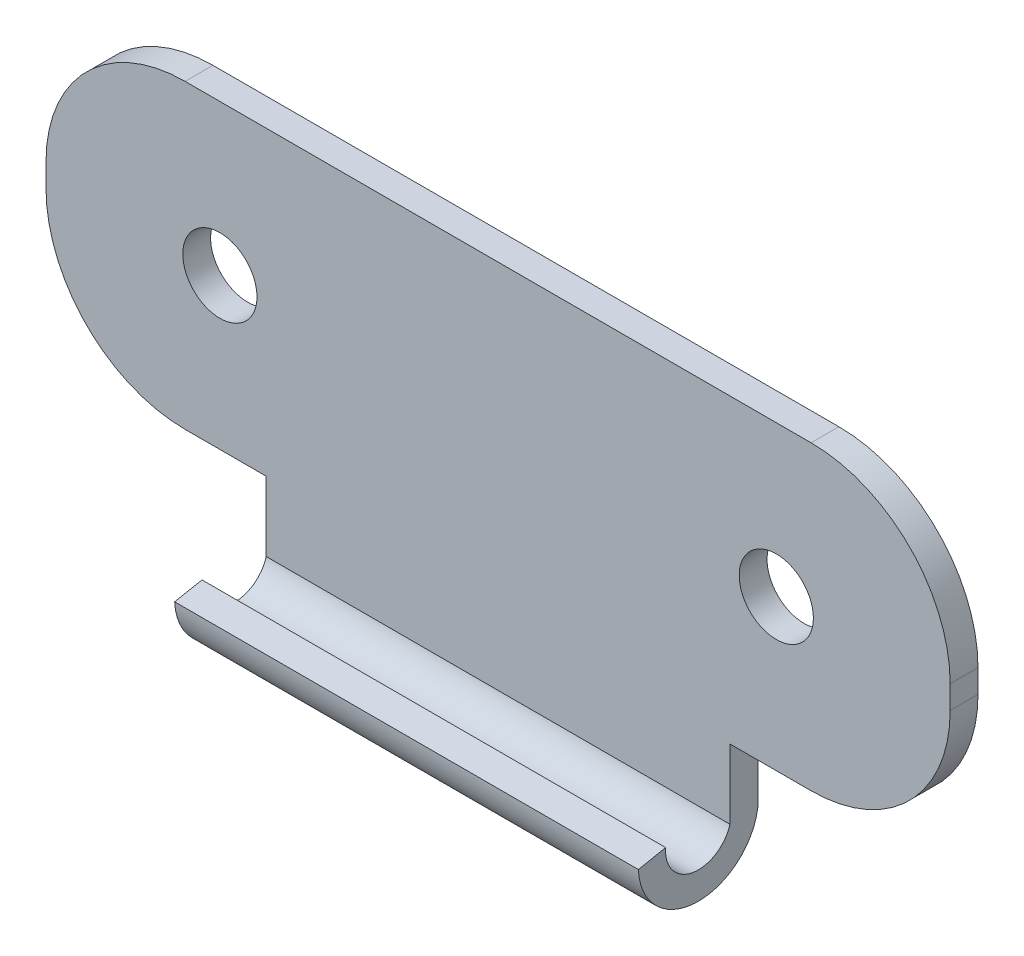
ISO-10303-21;
HEADER;
FILE_DESCRIPTION(('STEP AP214'),'2;1');
FILE_NAME('part.step','',(''),(''),'','','');
FILE_SCHEMA(('AUTOMOTIVE_DESIGN { 1 0 10303 214 1 1 1 1 }'));
ENDSEC;
DATA;
#1=APPLICATION_CONTEXT('core data for automotive mechanical design processes');
#2=APPLICATION_PROTOCOL_DEFINITION('international standard','automotive_design',2000,#1);
#3=PRODUCT_CONTEXT('',#1,'mechanical');
#4=PRODUCT('Part','Part','',(#3));
#5=PRODUCT_RELATED_PRODUCT_CATEGORY('part','',(#4));
#6=PRODUCT_DEFINITION_FORMATION('','',#4);
#7=PRODUCT_DEFINITION_CONTEXT('part definition',#1,'design');
#8=PRODUCT_DEFINITION('design','',#6,#7);
#9=PRODUCT_DEFINITION_SHAPE('','',#8);
#10=(LENGTH_UNIT() NAMED_UNIT(*) SI_UNIT(.MILLI.,.METRE.));
#11=(NAMED_UNIT(*) PLANE_ANGLE_UNIT() SI_UNIT($,.RADIAN.));
#12=(NAMED_UNIT(*) SI_UNIT($,.STERADIAN.) SOLID_ANGLE_UNIT());
#13=UNCERTAINTY_MEASURE_WITH_UNIT(LENGTH_MEASURE(1.E-05),#10,'distance_accuracy_value','');
#14=(GEOMETRIC_REPRESENTATION_CONTEXT(3) GLOBAL_UNCERTAINTY_ASSIGNED_CONTEXT((#13)) GLOBAL_UNIT_ASSIGNED_CONTEXT((#10,
#11,#12)) REPRESENTATION_CONTEXT('',''));
#15=CARTESIAN_POINT('',(0.,0.,0.));
#16=DIRECTION('',(0.,0.,1.));
#17=DIRECTION('',(1.,0.,0.));
#18=AXIS2_PLACEMENT_3D('',#15,#16,#17);
#19=CARTESIAN_POINT('',(10.9780600461894,2.42147806004619,1.2));
#20=DIRECTION('',(0.,0.,-1.));
#21=DIRECTION('',(-1.,0.,0.));
#22=AXIS2_PLACEMENT_3D('',#19,#20,#21);
#23=CYLINDRICAL_SURFACE('',#22,6.);
#24=CARTESIAN_POINT('',(10.9780600461894,2.42147806004619,0.));
#25=DIRECTION('',(0.,0.,1.));
#26=DIRECTION('',(1.,0.,0.));
#27=AXIS2_PLACEMENT_3D('',#24,#25,#26);
#28=CIRCLE('',#27,6.);
#29=CARTESIAN_POINT('',(16.9780600461894,2.42147806004615,0.));
#30=VERTEX_POINT('',#29);
#31=CARTESIAN_POINT('',(10.9780600461893,8.42147806004619,0.));
#32=VERTEX_POINT('',#31);
#33=EDGE_CURVE('E149',#30,#32,#28,.T.);
#34=ORIENTED_EDGE('',*,*,#33,.T.);
#35=DIRECTION('',(0.,0.,-1.));
#36=VECTOR('',#35,1.);
#37=CARTESIAN_POINT('',(10.9780600461893,8.42147806004619,1.2));
#38=LINE('',#37,#36);
#39=CARTESIAN_POINT('',(10.9780600461893,8.42147806004619,1.2));
#40=VERTEX_POINT('',#39);
#41=EDGE_CURVE('E11',#40,#32,#38,.T.);
#42=ORIENTED_EDGE('',*,*,#41,.F.);
#43=CARTESIAN_POINT('',(10.9780600461894,2.42147806004619,1.2));
#44=DIRECTION('',(0.,0.,1.));
#45=DIRECTION('',(1.,0.,0.));
#46=AXIS2_PLACEMENT_3D('',#43,#44,#45);
#47=CIRCLE('',#46,6.);
#48=CARTESIAN_POINT('',(16.9780600461894,2.42147806004615,1.2));
#49=VERTEX_POINT('',#48);
#50=EDGE_CURVE('E174',#49,#40,#47,.T.);
#51=ORIENTED_EDGE('',*,*,#50,.F.);
#52=DIRECTION('',(0.,0.,-1.));
#53=VECTOR('',#52,1.);
#54=CARTESIAN_POINT('',(16.9780600461894,2.42147806004615,1.2));
#55=LINE('',#54,#53);
#56=EDGE_CURVE('E145',#49,#30,#55,.T.);
#57=ORIENTED_EDGE('',*,*,#56,.T.);
#58=EDGE_LOOP('',(#34,#42,#51,#57));
#59=FACE_BOUND('',#58,.T.);
#60=ADVANCED_FACE('F34',(#59),#23,.T.);
#61=CARTESIAN_POINT('',(-16.0219399538106,8.42147806004619,1.2));
#62=DIRECTION('',(0.,-1.,0.));
#63=DIRECTION('',(0.,0.,-1.));
#64=AXIS2_PLACEMENT_3D('',#61,#62,#63);
#65=PLANE('',#64);
#66=DIRECTION('',(-1.,0.,0.));
#67=VECTOR('',#66,1.);
#68=CARTESIAN_POINT('',(-16.0219399538106,8.42147806004619,0.));
#69=LINE('',#68,#67);
#70=CARTESIAN_POINT('',(-16.0219399538106,8.42147806004619,0.));
#71=VERTEX_POINT('',#70);
#72=EDGE_CURVE('E152',#32,#71,#69,.T.);
#73=ORIENTED_EDGE('',*,*,#72,.T.);
#74=DIRECTION('',(0.,0.,-1.));
#75=VECTOR('',#74,1.);
#76=CARTESIAN_POINT('',(-16.0219399538106,8.42147806004619,1.2));
#77=LINE('',#76,#75);
#78=CARTESIAN_POINT('',(-16.0219399538106,8.42147806004619,1.2));
#79=VERTEX_POINT('',#78);
#80=EDGE_CURVE('E42',#79,#71,#77,.T.);
#81=ORIENTED_EDGE('',*,*,#80,.F.);
#82=DIRECTION('',(-1.,0.,0.));
#83=VECTOR('',#82,1.);
#84=CARTESIAN_POINT('',(-16.0219399538106,8.42147806004619,1.2));
#85=LINE('',#84,#83);
#86=EDGE_CURVE('E100',#40,#79,#85,.T.);
#87=ORIENTED_EDGE('',*,*,#86,.F.);
#88=ORIENTED_EDGE('',*,*,#41,.T.);
#89=EDGE_LOOP('',(#73,#81,#87,#88));
#90=FACE_BOUND('',#89,.T.);
#91=ADVANCED_FACE('F253',(#90),#65,.F.);
#92=CARTESIAN_POINT('',(-16.0219399538106,2.42147806004619,1.2));
#93=DIRECTION('',(0.,0.,-1.));
#94=DIRECTION('',(-1.,0.,0.));
#95=AXIS2_PLACEMENT_3D('',#92,#93,#94);
#96=CYLINDRICAL_SURFACE('',#95,6.);
#97=CARTESIAN_POINT('',(-16.0219399538106,2.42147806004619,0.));
#98=DIRECTION('',(0.,0.,1.));
#99=DIRECTION('',(-1.,0.,0.));
#100=AXIS2_PLACEMENT_3D('',#97,#98,#99);
#101=CIRCLE('',#100,6.);
#102=CARTESIAN_POINT('',(-22.0219399538106,2.42147806004615,0.));
#103=VERTEX_POINT('',#102);
#104=EDGE_CURVE('E155',#71,#103,#101,.T.);
#105=ORIENTED_EDGE('',*,*,#104,.T.);
#106=DIRECTION('',(0.,0.,-1.));
#107=VECTOR('',#106,1.);
#108=CARTESIAN_POINT('',(-22.0219399538106,2.42147806004615,1.2));
#109=LINE('',#108,#107);
#110=CARTESIAN_POINT('',(-22.0219399538106,2.42147806004615,1.2));
#111=VERTEX_POINT('',#110);
#112=EDGE_CURVE('E187',#111,#103,#109,.T.);
#113=ORIENTED_EDGE('',*,*,#112,.F.);
#114=CARTESIAN_POINT('',(-16.0219399538106,2.42147806004619,1.2));
#115=DIRECTION('',(0.,0.,1.));
#116=DIRECTION('',(-1.,0.,0.));
#117=AXIS2_PLACEMENT_3D('',#114,#115,#116);
#118=CIRCLE('',#117,6.);
#119=EDGE_CURVE('E195',#79,#111,#118,.T.);
#120=ORIENTED_EDGE('',*,*,#119,.F.);
#121=ORIENTED_EDGE('',*,*,#80,.T.);
#122=EDGE_LOOP('',(#105,#113,#120,#121));
#123=FACE_BOUND('',#122,.T.);
#124=ADVANCED_FACE('F193',(#123),#96,.T.);
#125=CARTESIAN_POINT('',(-22.0219399538106,2.42147806004615,1.2));
#126=DIRECTION('',(1.,0.,0.));
#127=DIRECTION('',(0.,0.,-1.));
#128=AXIS2_PLACEMENT_3D('',#125,#126,#127);
#129=PLANE('',#128);
#130=DIRECTION('',(0.,-1.,0.));
#131=VECTOR('',#130,1.);
#132=CARTESIAN_POINT('',(-22.0219399538106,2.42147806004615,0.));
#133=LINE('',#132,#131);
#134=CARTESIAN_POINT('',(-22.0219399538106,1.42147806004619,0.));
#135=VERTEX_POINT('',#134);
#136=EDGE_CURVE('E157',#103,#135,#133,.T.);
#137=ORIENTED_EDGE('',*,*,#136,.T.);
#138=DIRECTION('',(0.,0.,-1.));
#139=VECTOR('',#138,1.);
#140=CARTESIAN_POINT('',(-22.0219399538106,1.42147806004619,1.2));
#141=LINE('',#140,#139);
#142=CARTESIAN_POINT('',(-22.0219399538106,1.42147806004619,1.2));
#143=VERTEX_POINT('',#142);
#144=EDGE_CURVE('E184',#143,#135,#141,.T.);
#145=ORIENTED_EDGE('',*,*,#144,.F.);
#146=DIRECTION('',(0.,-1.,0.));
#147=VECTOR('',#146,1.);
#148=CARTESIAN_POINT('',(-22.0219399538106,2.42147806004615,1.2));
#149=LINE('',#148,#147);
#150=EDGE_CURVE('E213',#111,#143,#149,.T.);
#151=ORIENTED_EDGE('',*,*,#150,.F.);
#152=ORIENTED_EDGE('',*,*,#112,.T.);
#153=EDGE_LOOP('',(#137,#145,#151,#152));
#154=FACE_BOUND('',#153,.T.);
#155=ADVANCED_FACE('F204',(#154),#129,.F.);
#156=CARTESIAN_POINT('',(-16.0219399538106,1.42147806004619,1.2));
#157=DIRECTION('',(0.,0.,-1.));
#158=DIRECTION('',(-1.,0.,0.));
#159=AXIS2_PLACEMENT_3D('',#156,#157,#158);
#160=CYLINDRICAL_SURFACE('',#159,6.);
#161=CARTESIAN_POINT('',(-16.0219399538106,1.42147806004619,0.));
#162=DIRECTION('',(0.,0.,1.));
#163=DIRECTION('',(-1.,0.,0.));
#164=AXIS2_PLACEMENT_3D('',#161,#162,#163);
#165=CIRCLE('',#164,6.);
#166=CARTESIAN_POINT('',(-16.0219399538106,-4.57852193995381,0.));
#167=VERTEX_POINT('',#166);
#168=EDGE_CURVE('E159',#135,#167,#165,.T.);
#169=ORIENTED_EDGE('',*,*,#168,.T.);
#170=DIRECTION('',(0.,0.,-1.));
#171=VECTOR('',#170,1.);
#172=CARTESIAN_POINT('',(-16.0219399538106,-4.57852193995381,1.2));
#173=LINE('',#172,#171);
#174=CARTESIAN_POINT('',(-16.0219399538106,-4.57852193995381,1.2));
#175=VERTEX_POINT('',#174);
#176=EDGE_CURVE('E181',#175,#167,#173,.T.);
#177=ORIENTED_EDGE('',*,*,#176,.F.);
#178=CARTESIAN_POINT('',(-16.0219399538106,1.42147806004619,1.2));
#179=DIRECTION('',(0.,0.,1.));
#180=DIRECTION('',(-1.,0.,0.));
#181=AXIS2_PLACEMENT_3D('',#178,#179,#180);
#182=CIRCLE('',#181,6.);
#183=EDGE_CURVE('E210',#143,#175,#182,.T.);
#184=ORIENTED_EDGE('',*,*,#183,.F.);
#185=ORIENTED_EDGE('',*,*,#144,.T.);
#186=EDGE_LOOP('',(#169,#177,#184,#185));
#187=FACE_BOUND('',#186,.T.);
#188=ADVANCED_FACE('F208',(#187),#160,.T.);
#189=CARTESIAN_POINT('',(-16.0219399538106,-4.57852193995381,1.2));
#190=DIRECTION('',(0.,1.,0.));
#191=DIRECTION('',(-1.,0.,0.));
#192=AXIS2_PLACEMENT_3D('',#189,#190,#191);
#193=PLANE('',#192);
#194=DIRECTION('',(1.,0.,0.));
#195=VECTOR('',#194,1.);
#196=CARTESIAN_POINT('',(-16.0219399538106,-4.57852193995381,0.));
#197=LINE('',#196,#195);
#198=CARTESIAN_POINT('',(-12.5219399538106,-4.57852193995381,0.));
#199=VERTEX_POINT('',#198);
#200=EDGE_CURVE('E161',#167,#199,#197,.T.);
#201=ORIENTED_EDGE('',*,*,#200,.T.);
#202=DIRECTION('',(0.,0.,-1.));
#203=VECTOR('',#202,1.);
#204=CARTESIAN_POINT('',(-12.5219399538106,-4.57852193995381,1.2));
#205=LINE('',#204,#203);
#206=CARTESIAN_POINT('',(-12.5219399538106,-4.57852193995381,1.2));
#207=VERTEX_POINT('',#206);
#208=EDGE_CURVE('E178',#207,#199,#205,.T.);
#209=ORIENTED_EDGE('',*,*,#208,.F.);
#210=DIRECTION('',(1.,0.,0.));
#211=VECTOR('',#210,1.);
#212=CARTESIAN_POINT('',(-16.0219399538106,-4.57852193995381,1.2));
#213=LINE('',#212,#211);
#214=EDGE_CURVE('E212',#175,#207,#213,.T.);
#215=ORIENTED_EDGE('',*,*,#214,.F.);
#216=ORIENTED_EDGE('',*,*,#176,.T.);
#217=EDGE_LOOP('',(#201,#209,#215,#216));
#218=FACE_BOUND('',#217,.T.);
#219=ADVANCED_FACE('F266',(#218),#193,.F.);
#220=CARTESIAN_POINT('',(-12.5219399538106,-4.57852193995381,1.2));
#221=DIRECTION('',(1.,0.,0.));
#222=DIRECTION('',(0.,1.,0.));
#223=AXIS2_PLACEMENT_3D('',#220,#221,#222);
#224=PLANE('',#223);
#225=DIRECTION('',(0.,-1.,0.));
#226=VECTOR('',#225,1.);
#227=CARTESIAN_POINT('',(-12.5219399538106,-4.57852193995381,0.));
#228=LINE('',#227,#226);
#229=CARTESIAN_POINT('',(-12.5219399538106,-7.57852193995381,0.));
#230=VERTEX_POINT('',#229);
#231=EDGE_CURVE('E163',#199,#230,#228,.T.);
#232=ORIENTED_EDGE('',*,*,#231,.T.);
#233=CARTESIAN_POINT('',(-12.5219399538106,-7.18628966967744,2.56116135138184));
#234=DIRECTION('',(-1.,0.,0.));
#235=DIRECTION('',(0.,-0.151381312344085,-0.988475441411158));
#236=AXIS2_PLACEMENT_3D('',#233,#234,#235);
#237=CIRCLE('',#236,2.5910217331505);
#238=CARTESIAN_POINT('',(-12.5219399538106,-7.29409727261749,5.14993927588725));
#239=VERTEX_POINT('',#238);
#240=EDGE_CURVE('E410',#230,#239,#237,.T.);
#241=ORIENTED_EDGE('',*,*,#240,.T.);
#242=DIRECTION('',(0.,-0.192378844648508,0.981320732549611));
#243=VECTOR('',#242,1.);
#244=CARTESIAN_POINT('',(-12.5219399538106,-7.06324265903928,3.97235439682772));
#245=LINE('',#244,#243);
#246=CARTESIAN_POINT('',(-12.5219399538106,-7.06324265903928,3.97235439682772));
#247=VERTEX_POINT('',#246);
#248=EDGE_CURVE('E412',#247,#239,#245,.T.);
#249=ORIENTED_EDGE('',*,*,#248,.F.);
#250=CARTESIAN_POINT('',(-12.5219399538106,-7.18628966967744,2.56116135138184));
#251=DIRECTION('',(-1.,0.,0.));
#252=DIRECTION('',(0.,-0.276893159896233,-0.960900711833787));
#253=AXIS2_PLACEMENT_3D('',#250,#251,#252);
#254=CIRCLE('',#253,1.41654734419355);
#255=CARTESIAN_POINT('',(-12.5219399538106,-7.57852193995381,1.2));
#256=VERTEX_POINT('',#255);
#257=EDGE_CURVE('E373',#256,#247,#254,.T.);
#258=ORIENTED_EDGE('',*,*,#257,.F.);
#259=DIRECTION('',(0.,-1.,0.));
#260=VECTOR('',#259,1.);
#261=CARTESIAN_POINT('',(-12.5219399538106,-4.57852193995381,1.2));
#262=LINE('',#261,#260);
#263=EDGE_CURVE('E215',#207,#256,#262,.T.);
#264=ORIENTED_EDGE('',*,*,#263,.F.);
#265=ORIENTED_EDGE('',*,*,#208,.T.);
#266=EDGE_LOOP('',(#232,#241,#249,#258,#264,#265));
#267=FACE_BOUND('',#266,.T.);
#268=ADVANCED_FACE('F269',(#267),#224,.F.);
#269=CARTESIAN_POINT('',(7.47806004618938,-4.57852193995381,1.2));
#270=DIRECTION('',(-1.,0.,0.));
#271=DIRECTION('',(0.,-1.,0.));
#272=AXIS2_PLACEMENT_3D('',#269,#270,#271);
#273=PLANE('',#272);
#274=DIRECTION('',(0.,1.,0.));
#275=VECTOR('',#274,1.);
#276=CARTESIAN_POINT('',(7.47806004618938,-4.57852193995381,0.));
#277=LINE('',#276,#275);
#278=CARTESIAN_POINT('',(7.47806004618939,-7.57852193995381,0.));
#279=VERTEX_POINT('',#278);
#280=CARTESIAN_POINT('',(7.47806004618938,-4.57852193995381,0.));
#281=VERTEX_POINT('',#280);
#282=EDGE_CURVE('E169',#279,#281,#277,.T.);
#283=ORIENTED_EDGE('',*,*,#282,.T.);
#284=DIRECTION('',(0.,0.,-1.));
#285=VECTOR('',#284,1.);
#286=CARTESIAN_POINT('',(7.47806004618938,-4.57852193995381,1.2));
#287=LINE('',#286,#285);
#288=CARTESIAN_POINT('',(7.47806004618938,-4.57852193995381,1.2));
#289=VERTEX_POINT('',#288);
#290=EDGE_CURVE('E140',#289,#281,#287,.T.);
#291=ORIENTED_EDGE('',*,*,#290,.F.);
#292=DIRECTION('',(0.,1.,0.));
#293=VECTOR('',#292,1.);
#294=CARTESIAN_POINT('',(7.47806004618938,-4.57852193995381,1.2));
#295=LINE('',#294,#293);
#296=CARTESIAN_POINT('',(7.47806004618939,-7.57852193995381,1.2));
#297=VERTEX_POINT('',#296);
#298=EDGE_CURVE('E131',#297,#289,#295,.T.);
#299=ORIENTED_EDGE('',*,*,#298,.F.);
#300=CARTESIAN_POINT('',(7.47806004618939,-7.18628966967745,2.56116135138184));
#301=DIRECTION('',(-1.,0.,0.));
#302=DIRECTION('',(0.,-0.276893159896224,-0.96090071183379));
#303=AXIS2_PLACEMENT_3D('',#300,#301,#302);
#304=CIRCLE('',#303,1.41654734419354);
#305=CARTESIAN_POINT('',(7.47806004618939,-7.06324265903931,3.97235439682771));
#306=VERTEX_POINT('',#305);
#307=EDGE_CURVE('E233',#297,#306,#304,.T.);
#308=ORIENTED_EDGE('',*,*,#307,.T.);
#309=DIRECTION('',(0.,0.192378844648508,-0.981320732549611));
#310=VECTOR('',#309,1.);
#311=CARTESIAN_POINT('',(7.47806004618939,-7.06324265903931,3.97235439682771));
#312=LINE('',#311,#310);
#313=CARTESIAN_POINT('',(7.47806004618939,-7.29409727261752,5.14993927588725));
#314=VERTEX_POINT('',#313);
#315=EDGE_CURVE('E383',#314,#306,#312,.T.);
#316=ORIENTED_EDGE('',*,*,#315,.F.);
#317=CARTESIAN_POINT('',(7.47806004618939,-7.18628966967745,2.56116135138184));
#318=DIRECTION('',(-1.,0.,0.));
#319=DIRECTION('',(0.,-0.15138131234408,-0.988475441411158));
#320=AXIS2_PLACEMENT_3D('',#317,#318,#319);
#321=CIRCLE('',#320,2.5910217331505);
#322=EDGE_CURVE('E404',#279,#314,#321,.T.);
#323=ORIENTED_EDGE('',*,*,#322,.F.);
#324=EDGE_LOOP('',(#283,#291,#299,#308,#316,#323));
#325=FACE_BOUND('',#324,.T.);
#326=ADVANCED_FACE('F231',(#325),#273,.F.);
#327=CARTESIAN_POINT('',(7.47806004618938,-4.57852193995381,1.2));
#328=DIRECTION('',(0.,1.,0.));
#329=DIRECTION('',(-1.,0.,0.));
#330=AXIS2_PLACEMENT_3D('',#327,#328,#329);
#331=PLANE('',#330);
#332=DIRECTION('',(1.,0.,0.));
#333=VECTOR('',#332,1.);
#334=CARTESIAN_POINT('',(7.47806004618938,-4.57852193995381,0.));
#335=LINE('',#334,#333);
#336=CARTESIAN_POINT('',(10.9780600461893,-4.57852193995381,0.));
#337=VERTEX_POINT('',#336);
#338=EDGE_CURVE('E139',#281,#337,#335,.T.);
#339=ORIENTED_EDGE('',*,*,#338,.T.);
#340=DIRECTION('',(0.,0.,-1.));
#341=VECTOR('',#340,1.);
#342=CARTESIAN_POINT('',(10.9780600461893,-4.57852193995381,1.2));
#343=LINE('',#342,#341);
#344=CARTESIAN_POINT('',(10.9780600461893,-4.57852193995381,1.2));
#345=VERTEX_POINT('',#344);
#346=EDGE_CURVE('E136',#345,#337,#343,.T.);
#347=ORIENTED_EDGE('',*,*,#346,.F.);
#348=DIRECTION('',(1.,0.,0.));
#349=VECTOR('',#348,1.);
#350=CARTESIAN_POINT('',(7.47806004618938,-4.57852193995381,1.2));
#351=LINE('',#350,#349);
#352=EDGE_CURVE('E124',#289,#345,#351,.T.);
#353=ORIENTED_EDGE('',*,*,#352,.F.);
#354=ORIENTED_EDGE('',*,*,#290,.T.);
#355=EDGE_LOOP('',(#339,#347,#353,#354));
#356=FACE_BOUND('',#355,.T.);
#357=ADVANCED_FACE('F137',(#356),#331,.F.);
#358=CARTESIAN_POINT('',(10.9780600461894,1.42147806004619,1.2));
#359=DIRECTION('',(0.,0.,-1.));
#360=DIRECTION('',(-1.,0.,0.));
#361=AXIS2_PLACEMENT_3D('',#358,#359,#360);
#362=CYLINDRICAL_SURFACE('',#361,6.);
#363=CARTESIAN_POINT('',(10.9780600461894,1.42147806004619,0.));
#364=DIRECTION('',(0.,0.,1.));
#365=DIRECTION('',(-1.,0.,0.));
#366=AXIS2_PLACEMENT_3D('',#363,#364,#365);
#367=CIRCLE('',#366,6.);
#368=CARTESIAN_POINT('',(16.9780600461894,1.42147806004624,0.));
#369=VERTEX_POINT('',#368);
#370=EDGE_CURVE('E86',#337,#369,#367,.T.);
#371=ORIENTED_EDGE('',*,*,#370,.T.);
#372=DIRECTION('',(0.,0.,-1.));
#373=VECTOR('',#372,1.);
#374=CARTESIAN_POINT('',(16.9780600461894,1.42147806004624,1.2));
#375=LINE('',#374,#373);
#376=CARTESIAN_POINT('',(16.9780600461894,1.42147806004624,1.2));
#377=VERTEX_POINT('',#376);
#378=EDGE_CURVE('E141',#377,#369,#375,.T.);
#379=ORIENTED_EDGE('',*,*,#378,.F.);
#380=CARTESIAN_POINT('',(10.9780600461894,1.42147806004619,1.2));
#381=DIRECTION('',(0.,0.,1.));
#382=DIRECTION('',(-1.,0.,0.));
#383=AXIS2_PLACEMENT_3D('',#380,#381,#382);
#384=CIRCLE('',#383,6.);
#385=EDGE_CURVE('E128',#345,#377,#384,.T.);
#386=ORIENTED_EDGE('',*,*,#385,.F.);
#387=ORIENTED_EDGE('',*,*,#346,.T.);
#388=EDGE_LOOP('',(#371,#379,#386,#387));
#389=FACE_BOUND('',#388,.T.);
#390=ADVANCED_FACE('F143',(#389),#362,.T.);
#391=CARTESIAN_POINT('',(16.9780600461894,2.42147806004615,1.2));
#392=DIRECTION('',(-1.,0.,0.));
#393=DIRECTION('',(0.,0.,1.));
#394=AXIS2_PLACEMENT_3D('',#391,#392,#393);
#395=PLANE('',#394);
#396=DIRECTION('',(0.,1.,0.));
#397=VECTOR('',#396,1.);
#398=CARTESIAN_POINT('',(16.9780600461894,2.42147806004615,0.));
#399=LINE('',#398,#397);
#400=EDGE_CURVE('E92',#369,#30,#399,.T.);
#401=ORIENTED_EDGE('',*,*,#400,.T.);
#402=ORIENTED_EDGE('',*,*,#56,.F.);
#403=DIRECTION('',(0.,1.,0.));
#404=VECTOR('',#403,1.);
#405=CARTESIAN_POINT('',(16.9780600461894,2.42147806004615,1.2));
#406=LINE('',#405,#404);
#407=EDGE_CURVE('E50',#377,#49,#406,.T.);
#408=ORIENTED_EDGE('',*,*,#407,.F.);
#409=ORIENTED_EDGE('',*,*,#378,.T.);
#410=EDGE_LOOP('',(#401,#402,#408,#409));
#411=FACE_BOUND('',#410,.T.);
#412=ADVANCED_FACE('F241',(#411),#395,.F.);
#413=CARTESIAN_POINT('',(10.9780600461894,2.42147806004619,1.2));
#414=DIRECTION('',(0.,0.,1.));
#415=DIRECTION('',(1.,0.,0.));
#416=AXIS2_PLACEMENT_3D('',#413,#414,#415);
#417=PLANE('',#416);
#418=CARTESIAN_POINT('',(-14.5219399538106,1.92147806004619,1.2));
#419=DIRECTION('',(0.,0.,1.));
#420=DIRECTION('',(1.,0.,0.));
#421=AXIS2_PLACEMENT_3D('',#418,#419,#420);
#422=CIRCLE('',#421,1.6);
#423=CARTESIAN_POINT('',(-12.9219399538106,1.92147806004619,1.2));
#424=VERTEX_POINT('',#423);
#425=EDGE_CURVE('E389',#424,#424,#422,.T.);
#426=ORIENTED_EDGE('',*,*,#425,.F.);
#427=EDGE_LOOP('',(#426));
#428=FACE_BOUND('',#427,.T.);
#429=CARTESIAN_POINT('',(9.47806004618939,1.92147806004619,1.2));
#430=DIRECTION('',(0.,0.,1.));
#431=DIRECTION('',(1.,0.,0.));
#432=AXIS2_PLACEMENT_3D('',#429,#430,#431);
#433=CIRCLE('',#432,1.6);
#434=CARTESIAN_POINT('',(11.0780600461894,1.92147806004619,1.2));
#435=VERTEX_POINT('',#434);
#436=EDGE_CURVE('E378',#435,#435,#433,.T.);
#437=ORIENTED_EDGE('',*,*,#436,.F.);
#438=EDGE_LOOP('',(#437));
#439=FACE_BOUND('',#438,.T.);
#440=ORIENTED_EDGE('',*,*,#50,.T.);
#441=ORIENTED_EDGE('',*,*,#86,.T.);
#442=ORIENTED_EDGE('',*,*,#119,.T.);
#443=ORIENTED_EDGE('',*,*,#150,.T.);
#444=ORIENTED_EDGE('',*,*,#183,.T.);
#445=ORIENTED_EDGE('',*,*,#214,.T.);
#446=ORIENTED_EDGE('',*,*,#263,.T.);
#447=DIRECTION('',(1.,0.,0.));
#448=VECTOR('',#447,1.);
#449=CARTESIAN_POINT('',(-12.5219399538106,-7.57852193995381,1.2));
#450=LINE('',#449,#448);
#451=EDGE_CURVE('E222',#256,#297,#450,.T.);
#452=ORIENTED_EDGE('',*,*,#451,.T.);
#453=ORIENTED_EDGE('',*,*,#298,.T.);
#454=ORIENTED_EDGE('',*,*,#352,.T.);
#455=ORIENTED_EDGE('',*,*,#385,.T.);
#456=ORIENTED_EDGE('',*,*,#407,.T.);
#457=EDGE_LOOP('',(#440,#441,#442,#443,#444,#445,#446,#452,#453,#454,#455,#456));
#458=FACE_BOUND('',#457,.T.);
#459=ADVANCED_FACE('F126',(#428,#439,#458),#417,.T.);
#460=CARTESIAN_POINT('',(10.9780600461894,2.42147806004619,0.));
#461=DIRECTION('',(0.,0.,1.));
#462=DIRECTION('',(1.,0.,0.));
#463=AXIS2_PLACEMENT_3D('',#460,#461,#462);
#464=PLANE('',#463);
#465=CARTESIAN_POINT('',(-14.5219399538106,1.92147806004619,0.));
#466=DIRECTION('',(0.,0.,1.));
#467=DIRECTION('',(1.,0.,0.));
#468=AXIS2_PLACEMENT_3D('',#465,#466,#467);
#469=CIRCLE('',#468,1.6);
#470=CARTESIAN_POINT('',(-12.9219399538106,1.92147806004619,0.));
#471=VERTEX_POINT('',#470);
#472=EDGE_CURVE('E153',#471,#471,#469,.T.);
#473=ORIENTED_EDGE('',*,*,#472,.T.);
#474=EDGE_LOOP('',(#473));
#475=FACE_BOUND('',#474,.T.);
#476=CARTESIAN_POINT('',(9.47806004618939,1.92147806004619,0.));
#477=DIRECTION('',(0.,0.,1.));
#478=DIRECTION('',(1.,0.,0.));
#479=AXIS2_PLACEMENT_3D('',#476,#477,#478);
#480=CIRCLE('',#479,1.6);
#481=CARTESIAN_POINT('',(11.0780600461894,1.92147806004619,0.));
#482=VERTEX_POINT('',#481);
#483=EDGE_CURVE('E381',#482,#482,#480,.T.);
#484=ORIENTED_EDGE('',*,*,#483,.T.);
#485=EDGE_LOOP('',(#484));
#486=FACE_BOUND('',#485,.T.);
#487=ORIENTED_EDGE('',*,*,#33,.F.);
#488=ORIENTED_EDGE('',*,*,#400,.F.);
#489=ORIENTED_EDGE('',*,*,#370,.F.);
#490=ORIENTED_EDGE('',*,*,#338,.F.);
#491=ORIENTED_EDGE('',*,*,#282,.F.);
#492=DIRECTION('',(1.,0.,0.));
#493=VECTOR('',#492,1.);
#494=CARTESIAN_POINT('',(-12.5219399538106,-7.57852193995381,0.));
#495=LINE('',#494,#493);
#496=EDGE_CURVE('E166',#230,#279,#495,.T.);
#497=ORIENTED_EDGE('',*,*,#496,.F.);
#498=ORIENTED_EDGE('',*,*,#231,.F.);
#499=ORIENTED_EDGE('',*,*,#200,.F.);
#500=ORIENTED_EDGE('',*,*,#168,.F.);
#501=ORIENTED_EDGE('',*,*,#136,.F.);
#502=ORIENTED_EDGE('',*,*,#104,.F.);
#503=ORIENTED_EDGE('',*,*,#72,.F.);
#504=EDGE_LOOP('',(#487,#488,#489,#490,#491,#497,#498,#499,#500,#501,#502,#503));
#505=FACE_BOUND('',#504,.T.);
#506=ADVANCED_FACE('F199',(#475,#486,#505),#464,.F.);
#507=CARTESIAN_POINT('',(9.47806004618939,1.92147806004619,0.));
#508=DIRECTION('',(0.,0.,1.));
#509=DIRECTION('',(1.,0.,0.));
#510=AXIS2_PLACEMENT_3D('',#507,#508,#509);
#511=CYLINDRICAL_SURFACE('',#510,1.6);
#512=ORIENTED_EDGE('',*,*,#483,.F.);
#513=EDGE_LOOP('',(#512));
#514=FACE_BOUND('',#513,.T.);
#515=ORIENTED_EDGE('',*,*,#436,.T.);
#516=EDGE_LOOP('',(#515));
#517=FACE_BOUND('',#516,.T.);
#518=ADVANCED_FACE('F296',(#514,#517),#511,.F.);
#519=CARTESIAN_POINT('',(-14.5219399538106,1.92147806004619,0.));
#520=DIRECTION('',(0.,0.,1.));
#521=DIRECTION('',(1.,0.,0.));
#522=AXIS2_PLACEMENT_3D('',#519,#520,#521);
#523=CYLINDRICAL_SURFACE('',#522,1.6);
#524=ORIENTED_EDGE('',*,*,#472,.F.);
#525=EDGE_LOOP('',(#524));
#526=FACE_BOUND('',#525,.T.);
#527=ORIENTED_EDGE('',*,*,#425,.T.);
#528=EDGE_LOOP('',(#527));
#529=FACE_BOUND('',#528,.T.);
#530=ADVANCED_FACE('F301',(#526,#529),#523,.F.);
#531=CARTESIAN_POINT('',(0.,-7.29409727261751,5.14993927588725));
#532=DIRECTION('',(0.,0.981320732549611,0.192378844648508));
#533=DIRECTION('',(1.,0.,0.));
#534=AXIS2_PLACEMENT_3D('',#531,#532,#533);
#535=PLANE('',#534);
#536=ORIENTED_EDGE('',*,*,#248,.T.);
#537=DIRECTION('',(1.,0.,0.));
#538=VECTOR('',#537,1.);
#539=CARTESIAN_POINT('',(-12.5219399538106,-7.29409727261749,5.14993927588725));
#540=LINE('',#539,#538);
#541=EDGE_CURVE('E407',#239,#314,#540,.T.);
#542=ORIENTED_EDGE('',*,*,#541,.T.);
#543=ORIENTED_EDGE('',*,*,#315,.T.);
#544=DIRECTION('',(-1.,0.,0.));
#545=VECTOR('',#544,1.);
#546=CARTESIAN_POINT('',(-12.5219399538106,-7.06324265903928,3.97235439682772));
#547=LINE('',#546,#545);
#548=EDGE_CURVE('E371',#306,#247,#547,.T.);
#549=ORIENTED_EDGE('',*,*,#548,.T.);
#550=EDGE_LOOP('',(#536,#542,#543,#549));
#551=FACE_BOUND('',#550,.T.);
#552=ADVANCED_FACE('F313',(#551),#535,.T.);
#553=CARTESIAN_POINT('',(-12.5219399538106,-7.18628966967744,2.56116135138184));
#554=DIRECTION('',(-1.,0.,0.));
#555=DIRECTION('',(0.,-1.,0.));
#556=AXIS2_PLACEMENT_3D('',#553,#554,#555);
#557=CYLINDRICAL_SURFACE('',#556,2.5910217331505);
#558=ORIENTED_EDGE('',*,*,#322,.T.);
#559=ORIENTED_EDGE('',*,*,#541,.F.);
#560=ORIENTED_EDGE('',*,*,#240,.F.);
#561=ORIENTED_EDGE('',*,*,#496,.T.);
#562=EDGE_LOOP('',(#558,#559,#560,#561));
#563=FACE_BOUND('',#562,.T.);
#564=ADVANCED_FACE('F347',(#563),#557,.T.);
#565=CARTESIAN_POINT('',(-12.5219399538106,-7.18628966967744,2.56116135138184));
#566=DIRECTION('',(-1.,0.,0.));
#567=DIRECTION('',(0.,-1.,0.));
#568=AXIS2_PLACEMENT_3D('',#565,#566,#567);
#569=CYLINDRICAL_SURFACE('',#568,1.41654734419355);
#570=ORIENTED_EDGE('',*,*,#548,.F.);
#571=ORIENTED_EDGE('',*,*,#307,.F.);
#572=ORIENTED_EDGE('',*,*,#451,.F.);
#573=ORIENTED_EDGE('',*,*,#257,.T.);
#574=EDGE_LOOP('',(#570,#571,#572,#573));
#575=FACE_BOUND('',#574,.T.);
#576=ADVANCED_FACE('F316',(#575),#569,.F.);
#577=CLOSED_SHELL('',(#60,#91,#124,#155,#188,#219,#268,#326,#357,#390,#412,#459,#506,#518,#530,
#552,#564,#576));
#578=MANIFOLD_SOLID_BREP('B2',#577);
#579=ADVANCED_BREP_SHAPE_REPRESENTATION('',(#18,#578),#14);
#580=SHAPE_DEFINITION_REPRESENTATION(#9,#579);
ENDSEC;
END-ISO-10303-21;
